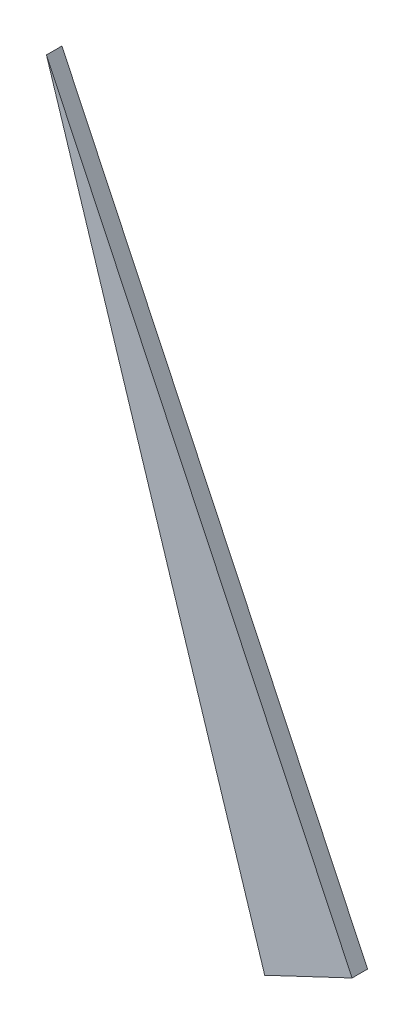
ISO-10303-21;
HEADER;
FILE_DESCRIPTION(('STEP AP214'),'2;1');
FILE_NAME('part.step','',(''),(''),'','','');
FILE_SCHEMA(('AUTOMOTIVE_DESIGN { 1 0 10303 214 1 1 1 1 }'));
ENDSEC;
DATA;
#1=APPLICATION_CONTEXT('core data for automotive mechanical design processes');
#2=APPLICATION_PROTOCOL_DEFINITION('international standard','automotive_design',2000,#1);
#3=PRODUCT_CONTEXT('',#1,'mechanical');
#4=PRODUCT('Part','Part','',(#3));
#5=PRODUCT_RELATED_PRODUCT_CATEGORY('part','',(#4));
#6=PRODUCT_DEFINITION_FORMATION('','',#4);
#7=PRODUCT_DEFINITION_CONTEXT('part definition',#1,'design');
#8=PRODUCT_DEFINITION('design','',#6,#7);
#9=PRODUCT_DEFINITION_SHAPE('','',#8);
#10=(LENGTH_UNIT() NAMED_UNIT(*) SI_UNIT(.MILLI.,.METRE.));
#11=(NAMED_UNIT(*) PLANE_ANGLE_UNIT() SI_UNIT($,.RADIAN.));
#12=(NAMED_UNIT(*) SI_UNIT($,.STERADIAN.) SOLID_ANGLE_UNIT());
#13=UNCERTAINTY_MEASURE_WITH_UNIT(LENGTH_MEASURE(1.E-05),#10,'distance_accuracy_value','');
#14=(GEOMETRIC_REPRESENTATION_CONTEXT(3) GLOBAL_UNCERTAINTY_ASSIGNED_CONTEXT((#13)) GLOBAL_UNIT_ASSIGNED_CONTEXT((#10,
#11,#12)) REPRESENTATION_CONTEXT('',''));
#15=CARTESIAN_POINT('',(0.,0.,0.));
#16=DIRECTION('',(0.,0.,1.));
#17=DIRECTION('',(1.,0.,0.));
#18=AXIS2_PLACEMENT_3D('',#15,#16,#17);
#19=CARTESIAN_POINT('',(-32.8064959042494,145.738826174934,5.08));
#20=DIRECTION('',(0.953160717035524,0.302464291281345,0.));
#21=DIRECTION('',(-0.302464291281345,0.953160717035524,0.));
#22=AXIS2_PLACEMENT_3D('',#19,#20,#21);
#23=PLANE('',#22);
#24=DIRECTION('',(0.302464291281345,-0.953160717035524,0.));
#25=VECTOR('',#24,1.);
#26=CARTESIAN_POINT('',(-32.8064959042494,145.738826174934,0.));
#27=LINE('',#26,#25);
#28=CARTESIAN_POINT('',(-32.8064959042494,145.738826174934,0.));
#29=VERTEX_POINT('',#28);
#30=CARTESIAN_POINT('',(38.9034214027151,-80.2418206951648,0.));
#31=VERTEX_POINT('',#30);
#32=EDGE_CURVE('E99',#29,#31,#27,.T.);
#33=ORIENTED_EDGE('',*,*,#32,.T.);
#34=DIRECTION('',(0.,0.,-1.));
#35=VECTOR('',#34,1.);
#36=CARTESIAN_POINT('',(38.9034214027151,-80.2418206951648,5.08));
#37=LINE('',#36,#35);
#38=CARTESIAN_POINT('',(38.9034214027151,-80.2418206951648,5.08));
#39=VERTEX_POINT('',#38);
#40=EDGE_CURVE('E11',#39,#31,#37,.T.);
#41=ORIENTED_EDGE('',*,*,#40,.F.);
#42=DIRECTION('',(0.302464291281345,-0.953160717035524,0.));
#43=VECTOR('',#42,1.);
#44=CARTESIAN_POINT('',(-32.8064959042494,145.738826174934,5.08));
#45=LINE('',#44,#43);
#46=CARTESIAN_POINT('',(-32.8064959042494,145.738826174934,5.08));
#47=VERTEX_POINT('',#46);
#48=EDGE_CURVE('E91',#47,#39,#45,.T.);
#49=ORIENTED_EDGE('',*,*,#48,.F.);
#50=DIRECTION('',(0.,0.,-1.));
#51=VECTOR('',#50,1.);
#52=CARTESIAN_POINT('',(-32.8064959042494,145.738826174934,5.08));
#53=LINE('',#52,#51);
#54=EDGE_CURVE('E100',#47,#29,#53,.T.);
#55=ORIENTED_EDGE('',*,*,#54,.T.);
#56=EDGE_LOOP('',(#33,#41,#49,#55));
#57=FACE_BOUND('',#56,.T.);
#58=ADVANCED_FACE('F43',(#57),#23,.F.);
#59=CARTESIAN_POINT('',(38.9034214027151,-80.2418206951648,5.08));
#60=DIRECTION('',(-0.427385100905814,0.904069674042729,0.));
#61=DIRECTION('',(-0.904069674042729,-0.427385100905815,0.));
#62=AXIS2_PLACEMENT_3D('',#59,#60,#61);
#63=PLANE('',#62);
#64=DIRECTION('',(0.904069674042729,0.427385100905814,0.));
#65=VECTOR('',#64,1.);
#66=CARTESIAN_POINT('',(38.9034214027151,-80.2418206951648,0.));
#67=LINE('',#66,#65);
#68=CARTESIAN_POINT('',(67.6076335535718,-66.6723437414052,0.));
#69=VERTEX_POINT('',#68);
#70=EDGE_CURVE('E78',#31,#69,#67,.T.);
#71=ORIENTED_EDGE('',*,*,#70,.T.);
#72=DIRECTION('',(0.,0.,-1.));
#73=VECTOR('',#72,1.);
#74=CARTESIAN_POINT('',(67.6076335535718,-66.6723437414052,5.08));
#75=LINE('',#74,#73);
#76=CARTESIAN_POINT('',(67.6076335535718,-66.6723437414052,5.08));
#77=VERTEX_POINT('',#76);
#78=EDGE_CURVE('E52',#77,#69,#75,.T.);
#79=ORIENTED_EDGE('',*,*,#78,.F.);
#80=DIRECTION('',(0.904069674042729,0.427385100905814,0.));
#81=VECTOR('',#80,1.);
#82=CARTESIAN_POINT('',(38.9034214027151,-80.2418206951648,5.08));
#83=LINE('',#82,#81);
#84=EDGE_CURVE('E86',#39,#77,#83,.T.);
#85=ORIENTED_EDGE('',*,*,#84,.F.);
#86=ORIENTED_EDGE('',*,*,#40,.T.);
#87=EDGE_LOOP('',(#71,#79,#85,#86));
#88=FACE_BOUND('',#87,.T.);
#89=ADVANCED_FACE('F87',(#88),#63,.F.);
#90=CARTESIAN_POINT('',(67.6076335535718,-66.6723437414052,5.08));
#91=DIRECTION('',(-0.904069674042729,-0.427385100905815,0.));
#92=DIRECTION('',(0.427385100905815,-0.904069674042729,0.));
#93=AXIS2_PLACEMENT_3D('',#90,#91,#92);
#94=PLANE('',#93);
#95=DIRECTION('',(-0.427385100905815,0.904069674042729,0.));
#96=VECTOR('',#95,1.);
#97=CARTESIAN_POINT('',(67.6076335535718,-66.6723437414052,0.));
#98=LINE('',#97,#96);
#99=EDGE_CURVE('E83',#69,#29,#98,.T.);
#100=ORIENTED_EDGE('',*,*,#99,.T.);
#101=ORIENTED_EDGE('',*,*,#54,.F.);
#102=DIRECTION('',(-0.427385100905815,0.904069674042729,0.));
#103=VECTOR('',#102,1.);
#104=CARTESIAN_POINT('',(67.6076335535718,-66.6723437414052,5.08));
#105=LINE('',#104,#103);
#106=EDGE_CURVE('E63',#77,#47,#105,.T.);
#107=ORIENTED_EDGE('',*,*,#106,.F.);
#108=ORIENTED_EDGE('',*,*,#78,.T.);
#109=EDGE_LOOP('',(#100,#101,#107,#108));
#110=FACE_BOUND('',#109,.T.);
#111=ADVANCED_FACE('F113',(#110),#94,.F.);
#112=CARTESIAN_POINT('',(0.,0.,5.08));
#113=DIRECTION('',(0.,0.,1.));
#114=DIRECTION('',(1.,0.,0.));
#115=AXIS2_PLACEMENT_3D('',#112,#113,#114);
#116=PLANE('',#115);
#117=ORIENTED_EDGE('',*,*,#48,.T.);
#118=ORIENTED_EDGE('',*,*,#84,.T.);
#119=ORIENTED_EDGE('',*,*,#106,.T.);
#120=EDGE_LOOP('',(#117,#118,#119));
#121=FACE_BOUND('',#120,.T.);
#122=ADVANCED_FACE('F94',(#121),#116,.T.);
#123=CARTESIAN_POINT('',(0.,0.,0.));
#124=DIRECTION('',(0.,0.,1.));
#125=DIRECTION('',(1.,0.,0.));
#126=AXIS2_PLACEMENT_3D('',#123,#124,#125);
#127=PLANE('',#126);
#128=ORIENTED_EDGE('',*,*,#32,.F.);
#129=ORIENTED_EDGE('',*,*,#99,.F.);
#130=ORIENTED_EDGE('',*,*,#70,.F.);
#131=EDGE_LOOP('',(#128,#129,#130));
#132=FACE_BOUND('',#131,.T.);
#133=ADVANCED_FACE('F114',(#132),#127,.F.);
#134=CLOSED_SHELL('',(#58,#89,#111,#122,#133));
#135=MANIFOLD_SOLID_BREP('B2',#134);
#136=ADVANCED_BREP_SHAPE_REPRESENTATION('',(#18,#135),#14);
#137=SHAPE_DEFINITION_REPRESENTATION(#9,#136);
ENDSEC;
END-ISO-10303-21;
